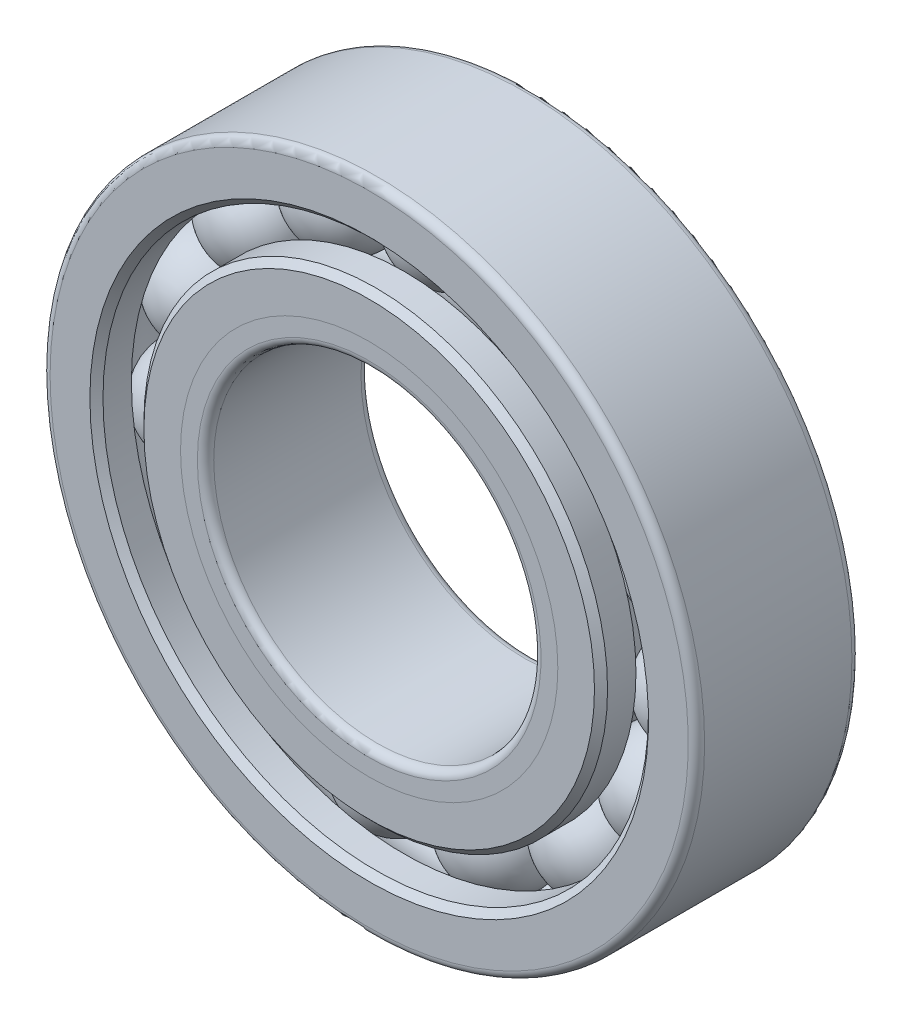
ISO-10303-21;
HEADER;
FILE_DESCRIPTION(('STEP AP214'),'2;1');
FILE_NAME('part.step','',(''),(''),'','','');
FILE_SCHEMA(('AUTOMOTIVE_DESIGN { 1 0 10303 214 1 1 1 1 }'));
ENDSEC;
DATA;
#1=APPLICATION_CONTEXT('core data for automotive mechanical design processes');
#2=APPLICATION_PROTOCOL_DEFINITION('international standard','automotive_design',2000,#1);
#3=PRODUCT_CONTEXT('',#1,'mechanical');
#4=PRODUCT('Part','Part','',(#3));
#5=PRODUCT_RELATED_PRODUCT_CATEGORY('part','',(#4));
#6=PRODUCT_DEFINITION_FORMATION('','',#4);
#7=PRODUCT_DEFINITION_CONTEXT('part definition',#1,'design');
#8=PRODUCT_DEFINITION('design','',#6,#7);
#9=PRODUCT_DEFINITION_SHAPE('','',#8);
#10=(LENGTH_UNIT() NAMED_UNIT(*) SI_UNIT(.MILLI.,.METRE.));
#11=(NAMED_UNIT(*) PLANE_ANGLE_UNIT() SI_UNIT($,.RADIAN.));
#12=(NAMED_UNIT(*) SI_UNIT($,.STERADIAN.) SOLID_ANGLE_UNIT());
#13=UNCERTAINTY_MEASURE_WITH_UNIT(LENGTH_MEASURE(1.E-05),#10,'distance_accuracy_value','');
#14=(GEOMETRIC_REPRESENTATION_CONTEXT(3) GLOBAL_UNCERTAINTY_ASSIGNED_CONTEXT((#13)) GLOBAL_UNIT_ASSIGNED_CONTEXT((#10,
#11,#12)) REPRESENTATION_CONTEXT('',''));
#15=CARTESIAN_POINT('',(0.,0.,0.));
#16=DIRECTION('',(0.,0.,1.));
#17=DIRECTION('',(1.,0.,0.));
#18=AXIS2_PLACEMENT_3D('',#15,#16,#17);
#19=CARTESIAN_POINT('',(0.,0.,-6.36));
#20=DIRECTION('',(0.,0.,1.));
#21=DIRECTION('',(1.,0.,0.));
#22=AXIS2_PLACEMENT_3D('',#19,#20,#21);
#23=CYLINDRICAL_SURFACE('',#22,14.6414066666667);
#24=CARTESIAN_POINT('',(0.,0.,-6.35));
#25=DIRECTION('',(0.,0.,1.));
#26=DIRECTION('',(1.,0.,0.));
#27=AXIS2_PLACEMENT_3D('',#24,#25,#26);
#28=CIRCLE('',#27,14.6414066666667);
#29=CARTESIAN_POINT('',(14.6414066666667,0.,-6.35));
#30=VERTEX_POINT('',#29);
#31=EDGE_CURVE('E57',#30,#30,#28,.T.);
#32=ORIENTED_EDGE('',*,*,#31,.T.);
#33=EDGE_LOOP('',(#32));
#34=FACE_BOUND('',#33,.T.);
#35=CARTESIAN_POINT('',(0.,0.,6.35));
#36=DIRECTION('',(0.,0.,-1.));
#37=DIRECTION('',(-1.,0.,0.));
#38=AXIS2_PLACEMENT_3D('',#35,#36,#37);
#39=CIRCLE('',#38,14.6414066666667);
#40=CARTESIAN_POINT('',(-14.6414066666667,0.,6.35));
#41=VERTEX_POINT('',#40);
#42=EDGE_CURVE('E45',#41,#41,#39,.T.);
#43=ORIENTED_EDGE('',*,*,#42,.T.);
#44=EDGE_LOOP('',(#43));
#45=FACE_BOUND('',#44,.T.);
#46=ADVANCED_FACE('F41',(#34,#45),#23,.T.);
#47=CARTESIAN_POINT('',(0.,12.7,-6.35));
#48=DIRECTION('',(0.,0.,1.));
#49=DIRECTION('',(1.,0.,0.));
#50=AXIS2_PLACEMENT_3D('',#47,#48,#49);
#51=PLANE('',#50);
#52=CARTESIAN_POINT('',(0.,0.,-6.35));
#53=DIRECTION('',(0.,0.,1.));
#54=DIRECTION('',(1.,0.,0.));
#55=AXIS2_PLACEMENT_3D('',#52,#53,#54);
#56=CIRCLE('',#55,13.335);
#57=CARTESIAN_POINT('',(13.335,0.,-6.35));
#58=VERTEX_POINT('',#57);
#59=EDGE_CURVE('E11',#58,#58,#56,.T.);
#60=ORIENTED_EDGE('',*,*,#59,.T.);
#61=EDGE_LOOP('',(#60));
#62=FACE_BOUND('',#61,.T.);
#63=ORIENTED_EDGE('',*,*,#31,.F.);
#64=EDGE_LOOP('',(#63));
#65=FACE_BOUND('',#64,.T.);
#66=ADVANCED_FACE('F43',(#62,#65),#51,.F.);
#67=CARTESIAN_POINT('',(0.,17.99336,6.35));
#68=DIRECTION('',(0.,0.,-1.));
#69=DIRECTION('',(-1.,0.,0.));
#70=AXIS2_PLACEMENT_3D('',#67,#68,#69);
#71=PLANE('',#70);
#72=CARTESIAN_POINT('',(0.,0.,6.35));
#73=DIRECTION('',(0.,0.,-1.));
#74=DIRECTION('',(-1.,0.,0.));
#75=AXIS2_PLACEMENT_3D('',#72,#73,#74);
#76=CIRCLE('',#75,13.335);
#77=CARTESIAN_POINT('',(-13.335,0.,6.35));
#78=VERTEX_POINT('',#77);
#79=EDGE_CURVE('E59',#78,#78,#76,.T.);
#80=ORIENTED_EDGE('',*,*,#79,.T.);
#81=EDGE_LOOP('',(#80));
#82=FACE_BOUND('',#81,.T.);
#83=ORIENTED_EDGE('',*,*,#42,.F.);
#84=EDGE_LOOP('',(#83));
#85=FACE_BOUND('',#84,.T.);
#86=ADVANCED_FACE('F68',(#82,#85),#71,.F.);
#87=CARTESIAN_POINT('',(0.,0.,6.35));
#88=DIRECTION('',(0.,0.,1.));
#89=DIRECTION('',(1.,0.,0.));
#90=AXIS2_PLACEMENT_3D('',#87,#88,#89);
#91=CYLINDRICAL_SURFACE('',#90,12.7);
#92=CARTESIAN_POINT('',(0.,0.,-5.715));
#93=DIRECTION('',(0.,0.,1.));
#94=DIRECTION('',(1.,0.,0.));
#95=AXIS2_PLACEMENT_3D('',#92,#93,#94);
#96=CIRCLE('',#95,12.7);
#97=CARTESIAN_POINT('',(12.7,0.,-5.715));
#98=VERTEX_POINT('',#97);
#99=EDGE_CURVE('E54',#98,#98,#96,.F.);
#100=ORIENTED_EDGE('',*,*,#99,.T.);
#101=EDGE_LOOP('',(#100));
#102=FACE_BOUND('',#101,.T.);
#103=CARTESIAN_POINT('',(0.,0.,5.715));
#104=DIRECTION('',(0.,0.,-1.));
#105=DIRECTION('',(-1.,0.,0.));
#106=AXIS2_PLACEMENT_3D('',#103,#104,#105);
#107=CIRCLE('',#106,12.7);
#108=CARTESIAN_POINT('',(-12.7,0.,5.715));
#109=VERTEX_POINT('',#108);
#110=EDGE_CURVE('E49',#109,#109,#107,.F.);
#111=ORIENTED_EDGE('',*,*,#110,.T.);
#112=EDGE_LOOP('',(#111));
#113=FACE_BOUND('',#112,.T.);
#114=ADVANCED_FACE('F70',(#102,#113),#91,.F.);
#115=CARTESIAN_POINT('',(0.,0.,-5.715));
#116=DIRECTION('',(0.,0.,1.));
#117=DIRECTION('',(1.,0.,0.));
#118=AXIS2_PLACEMENT_3D('',#115,#116,#117);
#119=TOROIDAL_SURFACE('',#118,13.335,0.635);
#120=ORIENTED_EDGE('',*,*,#99,.F.);
#121=EDGE_LOOP('',(#120));
#122=FACE_BOUND('',#121,.T.);
#123=ORIENTED_EDGE('',*,*,#59,.F.);
#124=EDGE_LOOP('',(#123));
#125=FACE_BOUND('',#124,.T.);
#126=ADVANCED_FACE('F76',(#122,#125),#119,.T.);
#127=CARTESIAN_POINT('',(0.,0.,5.715));
#128=DIRECTION('',(0.,0.,-1.));
#129=DIRECTION('',(-1.,0.,0.));
#130=AXIS2_PLACEMENT_3D('',#127,#128,#129);
#131=TOROIDAL_SURFACE('',#130,13.335,0.635);
#132=ORIENTED_EDGE('',*,*,#79,.F.);
#133=EDGE_LOOP('',(#132));
#134=FACE_BOUND('',#133,.T.);
#135=ORIENTED_EDGE('',*,*,#110,.F.);
#136=EDGE_LOOP('',(#135));
#137=FACE_BOUND('',#136,.T.);
#138=ADVANCED_FACE('F81',(#134,#137),#131,.T.);
#139=CLOSED_SHELL('',(#46,#66,#86,#114,#126,#138));
#140=MANIFOLD_SOLID_BREP('B2',#139);
#141=CARTESIAN_POINT('',(0.,0.,-6.36));
#142=DIRECTION('',(0.,0.,1.));
#143=DIRECTION('',(1.,0.,0.));
#144=AXIS2_PLACEMENT_3D('',#141,#142,#143);
#145=CYLINDRICAL_SURFACE('',#144,14.6414066666667);
#146=CARTESIAN_POINT('',(0.,0.,6.35));
#147=DIRECTION('',(0.,0.,-1.));
#148=DIRECTION('',(-1.,0.,0.));
#149=AXIS2_PLACEMENT_3D('',#146,#147,#148);
#150=CIRCLE('',#149,14.6414066666667);
#151=CARTESIAN_POINT('',(-14.6414066666667,0.,6.35));
#152=VERTEX_POINT('',#151);
#153=EDGE_CURVE('E144',#152,#152,#150,.T.);
#154=ORIENTED_EDGE('',*,*,#153,.F.);
#155=EDGE_LOOP('',(#154));
#156=FACE_BOUND('',#155,.T.);
#157=CARTESIAN_POINT('',(0.,0.,-6.35));
#158=DIRECTION('',(0.,0.,1.));
#159=DIRECTION('',(1.,0.,0.));
#160=AXIS2_PLACEMENT_3D('',#157,#158,#159);
#161=CIRCLE('',#160,14.6414066666667);
#162=CARTESIAN_POINT('',(14.6414066666667,0.,-6.35));
#163=VERTEX_POINT('',#162);
#164=EDGE_CURVE('E40',#163,#163,#161,.T.);
#165=ORIENTED_EDGE('',*,*,#164,.F.);
#166=EDGE_LOOP('',(#165));
#167=FACE_BOUND('',#166,.T.);
#168=ADVANCED_FACE('F138',(#156,#167),#145,.F.);
#169=CARTESIAN_POINT('',(0.,0.,0.));
#170=DIRECTION('',(0.,0.,1.));
#171=DIRECTION('',(1.,0.,0.));
#172=AXIS2_PLACEMENT_3D('',#169,#170,#171);
#173=TOROIDAL_SURFACE('',#172,19.58086,3.96875);
#174=CARTESIAN_POINT('',(0.,0.,-3.6374194578712));
#175=DIRECTION('',(0.,0.,1.));
#176=DIRECTION('',(1.,0.,0.));
#177=AXIS2_PLACEMENT_3D('',#174,#175,#176);
#178=CIRCLE('',#177,17.99336);
#179=CARTESIAN_POINT('',(17.99336,0.,-3.6374194578712));
#180=VERTEX_POINT('',#179);
#181=EDGE_CURVE('E166',#180,#180,#178,.T.);
#182=ORIENTED_EDGE('',*,*,#181,.T.);
#183=EDGE_LOOP('',(#182));
#184=FACE_BOUND('',#183,.T.);
#185=CARTESIAN_POINT('',(0.,0.,3.6374194578712));
#186=DIRECTION('',(0.,0.,-1.));
#187=DIRECTION('',(-1.,0.,0.));
#188=AXIS2_PLACEMENT_3D('',#185,#186,#187);
#189=CIRCLE('',#188,17.99336);
#190=CARTESIAN_POINT('',(-17.99336,0.,3.6374194578712));
#191=VERTEX_POINT('',#190);
#192=EDGE_CURVE('E163',#191,#191,#189,.T.);
#193=ORIENTED_EDGE('',*,*,#192,.T.);
#194=EDGE_LOOP('',(#193));
#195=FACE_BOUND('',#194,.T.);
#196=ADVANCED_FACE('F170',(#184,#195),#173,.F.);
#197=CARTESIAN_POINT('',(0.,0.,6.35));
#198=DIRECTION('',(0.,0.,1.));
#199=DIRECTION('',(1.,0.,0.));
#200=AXIS2_PLACEMENT_3D('',#197,#198,#199);
#201=CYLINDRICAL_SURFACE('',#200,17.99336);
#202=CARTESIAN_POINT('',(0.,0.,5.84199999999999));
#203=DIRECTION('',(0.,0.,-1.));
#204=DIRECTION('',(-1.,0.,0.));
#205=AXIS2_PLACEMENT_3D('',#202,#203,#204);
#206=CIRCLE('',#205,17.99336);
#207=CARTESIAN_POINT('',(-17.99336,0.,5.84199999999999));
#208=VERTEX_POINT('',#207);
#209=EDGE_CURVE('E148',#208,#208,#206,.T.);
#210=ORIENTED_EDGE('',*,*,#209,.T.);
#211=EDGE_LOOP('',(#210));
#212=FACE_BOUND('',#211,.T.);
#213=ORIENTED_EDGE('',*,*,#192,.F.);
#214=EDGE_LOOP('',(#213));
#215=FACE_BOUND('',#214,.T.);
#216=ADVANCED_FACE('F179',(#212,#215),#201,.T.);
#217=CARTESIAN_POINT('',(0.,0.,6.35));
#218=DIRECTION('',(0.,0.,-1.));
#219=DIRECTION('',(-1.,0.,0.));
#220=AXIS2_PLACEMENT_3D('',#217,#218,#219);
#221=CONICAL_SURFACE('',#220,17.48536,0.785398163397442);
#222=ORIENTED_EDGE('',*,*,#209,.F.);
#223=EDGE_LOOP('',(#222));
#224=FACE_BOUND('',#223,.T.);
#225=CARTESIAN_POINT('',(0.,0.,6.35));
#226=DIRECTION('',(0.,0.,-1.));
#227=DIRECTION('',(-1.,0.,0.));
#228=AXIS2_PLACEMENT_3D('',#225,#226,#227);
#229=CIRCLE('',#228,17.48536);
#230=CARTESIAN_POINT('',(-17.48536,0.,6.35));
#231=VERTEX_POINT('',#230);
#232=EDGE_CURVE('E152',#231,#231,#229,.F.);
#233=ORIENTED_EDGE('',*,*,#232,.F.);
#234=EDGE_LOOP('',(#233));
#235=FACE_BOUND('',#234,.T.);
#236=ADVANCED_FACE('F187',(#224,#235),#221,.T.);
#237=CARTESIAN_POINT('',(0.,17.99336,6.35));
#238=DIRECTION('',(0.,0.,-1.));
#239=DIRECTION('',(-1.,0.,0.));
#240=AXIS2_PLACEMENT_3D('',#237,#238,#239);
#241=PLANE('',#240);
#242=ORIENTED_EDGE('',*,*,#153,.T.);
#243=EDGE_LOOP('',(#242));
#244=FACE_BOUND('',#243,.T.);
#245=ORIENTED_EDGE('',*,*,#232,.T.);
#246=EDGE_LOOP('',(#245));
#247=FACE_BOUND('',#246,.T.);
#248=ADVANCED_FACE('F176',(#244,#247),#241,.F.);
#249=CARTESIAN_POINT('',(0.,0.,-5.842));
#250=DIRECTION('',(0.,0.,1.));
#251=DIRECTION('',(1.,0.,0.));
#252=AXIS2_PLACEMENT_3D('',#249,#250,#251);
#253=CIRCLE('',#252,17.99336);
#254=CARTESIAN_POINT('',(17.99336,0.,-5.842));
#255=VERTEX_POINT('',#254);
#256=EDGE_CURVE('E160',#255,#255,#253,.T.);
#257=ORIENTED_EDGE('',*,*,#256,.T.);
#258=EDGE_LOOP('',(#257));
#259=FACE_BOUND('',#258,.T.);
#260=ORIENTED_EDGE('',*,*,#181,.F.);
#261=EDGE_LOOP('',(#260));
#262=FACE_BOUND('',#261,.T.);
#263=ADVANCED_FACE('F173',(#259,#262),#201,.T.);
#264=CARTESIAN_POINT('',(0.,0.,-5.842));
#265=DIRECTION('',(0.,0.,1.));
#266=DIRECTION('',(1.,0.,0.));
#267=AXIS2_PLACEMENT_3D('',#264,#265,#266);
#268=CONICAL_SURFACE('',#267,17.99336,0.785398163397448);
#269=CARTESIAN_POINT('',(0.,0.,-6.35));
#270=DIRECTION('',(0.,0.,1.));
#271=DIRECTION('',(1.,0.,0.));
#272=AXIS2_PLACEMENT_3D('',#269,#270,#271);
#273=CIRCLE('',#272,17.48536);
#274=CARTESIAN_POINT('',(17.48536,0.,-6.35));
#275=VERTEX_POINT('',#274);
#276=EDGE_CURVE('E157',#275,#275,#273,.F.);
#277=ORIENTED_EDGE('',*,*,#276,.F.);
#278=EDGE_LOOP('',(#277));
#279=FACE_BOUND('',#278,.T.);
#280=ORIENTED_EDGE('',*,*,#256,.F.);
#281=EDGE_LOOP('',(#280));
#282=FACE_BOUND('',#281,.T.);
#283=ADVANCED_FACE('F175',(#279,#282),#268,.T.);
#284=CARTESIAN_POINT('',(0.,12.7,-6.35));
#285=DIRECTION('',(0.,0.,1.));
#286=DIRECTION('',(1.,0.,0.));
#287=AXIS2_PLACEMENT_3D('',#284,#285,#286);
#288=PLANE('',#287);
#289=ORIENTED_EDGE('',*,*,#164,.T.);
#290=EDGE_LOOP('',(#289));
#291=FACE_BOUND('',#290,.T.);
#292=ORIENTED_EDGE('',*,*,#276,.T.);
#293=EDGE_LOOP('',(#292));
#294=FACE_BOUND('',#293,.T.);
#295=ADVANCED_FACE('F184',(#291,#294),#288,.F.);
#296=CLOSED_SHELL('',(#168,#196,#216,#236,#248,#263,#283,#295));
#297=MANIFOLD_SOLID_BREP('B6',#296);
#298=CARTESIAN_POINT('',(-7.96425326493699,17.8880057097358,0.));
#299=DIRECTION('',(0.,0.,1.));
#300=DIRECTION('',(-0.406736643075789,0.913545457642606,0.));
#301=AXIS2_PLACEMENT_3D('',#298,#299,#300);
#302=SPHERICAL_SURFACE('',#301,3.96875);
#303=CARTESIAN_POINT('',(-7.96425326493699,17.8880057097358,3.96875));
#304=VERTEX_POINT('',#303);
#305=VERTEX_LOOP('',#304);
#306=FACE_BOUND('',#305,.T.);
#307=ADVANCED_FACE('F264',(#306),#302,.T.);
#308=CLOSED_SHELL('',(#307));
#309=MANIFOLD_SOLID_BREP('B35',#308);
#310=CARTESIAN_POINT('',(-14.5514147873971,13.1021527248281,0.));
#311=DIRECTION('',(0.,0.,1.));
#312=DIRECTION('',(-0.743144825477386,0.669130606358867,0.));
#313=AXIS2_PLACEMENT_3D('',#310,#311,#312);
#314=SPHERICAL_SURFACE('',#313,3.96875);
#315=CARTESIAN_POINT('',(-14.5514147873971,13.1021527248281,3.96875));
#316=VERTEX_POINT('',#315);
#317=VERTEX_LOOP('',#316);
#318=FACE_BOUND('',#317,.T.);
#319=ADVANCED_FACE('F284',(#318),#314,.T.);
#320=CLOSED_SHELL('',(#319));
#321=MANIFOLD_SOLID_BREP('B134',#320);
#322=CARTESIAN_POINT('',(-18.6225044976631,6.05081850447683,0.));
#323=DIRECTION('',(0.,0.,1.));
#324=DIRECTION('',(-0.95105651629515,0.309016994374957,0.));
#325=AXIS2_PLACEMENT_3D('',#322,#323,#324);
#326=SPHERICAL_SURFACE('',#325,3.96875);
#327=CARTESIAN_POINT('',(-18.6225044976631,6.05081850447683,3.96875));
#328=VERTEX_POINT('',#327);
#329=VERTEX_LOOP('',#328);
#330=FACE_BOUND('',#329,.T.);
#331=ADVANCED_FACE('F304',(#330),#326,.T.);
#332=CLOSED_SHELL('',(#331));
#333=MANIFOLD_SOLID_BREP('B260',#332);
#334=CARTESIAN_POINT('',(-19.4735940001408,-2.04675720525887,0.));
#335=DIRECTION('',(0.,0.,1.));
#336=DIRECTION('',(-0.994521895368274,-0.104528463267644,0.));
#337=AXIS2_PLACEMENT_3D('',#334,#335,#336);
#338=SPHERICAL_SURFACE('',#337,3.96875);
#339=CARTESIAN_POINT('',(-19.4735940001408,-2.04675720525887,3.96875));
#340=VERTEX_POINT('',#339);
#341=VERTEX_LOOP('',#340);
#342=FACE_BOUND('',#341,.T.);
#343=ADVANCED_FACE('F324',(#342),#338,.T.);
#344=CLOSED_SHELL('',(#343));
#345=MANIFOLD_SOLID_BREP('B280',#344);
#346=CARTESIAN_POINT('',(-16.9575221879467,-9.79042999999984,0.));
#347=DIRECTION('',(0.,0.,1.));
#348=DIRECTION('',(-0.866025403784443,-0.499999999999992,0.));
#349=AXIS2_PLACEMENT_3D('',#346,#347,#348);
#350=SPHERICAL_SURFACE('',#349,3.96875);
#351=CARTESIAN_POINT('',(-16.9575221879467,-9.79042999999984,3.96875));
#352=VERTEX_POINT('',#351);
#353=VERTEX_LOOP('',#352);
#354=FACE_BOUND('',#353,.T.);
#355=ADVANCED_FACE('F344',(#354),#350,.T.);
#356=CLOSED_SHELL('',(#355));
#357=MANIFOLD_SOLID_BREP('B300',#356);
#358=CARTESIAN_POINT('',(-11.5093407352037,-15.8412485044765,0.));
#359=DIRECTION('',(0.,0.,1.));
#360=DIRECTION('',(-0.58778525229248,-0.809016994374943,0.));
#361=AXIS2_PLACEMENT_3D('',#358,#359,#360);
#362=SPHERICAL_SURFACE('',#361,3.96875);
#363=CARTESIAN_POINT('',(-11.5093407352037,-15.8412485044765,3.96875));
#364=VERTEX_POINT('',#363);
#365=VERTEX_LOOP('',#364);
#366=FACE_BOUND('',#365,.T.);
#367=ADVANCED_FACE('F364',(#366),#362,.T.);
#368=CLOSED_SHELL('',(#367));
#369=MANIFOLD_SOLID_BREP('B320',#368);
#370=CARTESIAN_POINT('',(-4.07108971026597,-19.1529712293045,0.));
#371=DIRECTION('',(0.,0.,1.));
#372=DIRECTION('',(-0.207911690817766,-0.978147600733804,0.));
#373=AXIS2_PLACEMENT_3D('',#370,#371,#372);
#374=SPHERICAL_SURFACE('',#373,3.96875);
#375=CARTESIAN_POINT('',(-4.07108971026597,-19.1529712293045,3.96875));
#376=VERTEX_POINT('',#375);
#377=VERTEX_LOOP('',#376);
#378=FACE_BOUND('',#377,.T.);
#379=ADVANCED_FACE('F384',(#378),#374,.T.);
#380=CLOSED_SHELL('',(#379));
#381=MANIFOLD_SOLID_BREP('B340',#380);
#382=CARTESIAN_POINT('',(4.07108971026571,-19.1529712293046,0.));
#383=DIRECTION('',(0.,0.,1.));
#384=DIRECTION('',(0.207911690817753,-0.978147600733807,0.));
#385=AXIS2_PLACEMENT_3D('',#382,#383,#384);
#386=SPHERICAL_SURFACE('',#385,3.96875);
#387=CARTESIAN_POINT('',(4.07108971026571,-19.1529712293046,3.96875));
#388=VERTEX_POINT('',#387);
#389=VERTEX_LOOP('',#388);
#390=FACE_BOUND('',#389,.T.);
#391=ADVANCED_FACE('F404',(#390),#386,.T.);
#392=CLOSED_SHELL('',(#391));
#393=MANIFOLD_SOLID_BREP('B360',#392);
#394=CARTESIAN_POINT('',(11.5093407352035,-15.8412485044767,0.));
#395=DIRECTION('',(0.,0.,1.));
#396=DIRECTION('',(0.587785252292469,-0.80901699437495,0.));
#397=AXIS2_PLACEMENT_3D('',#394,#395,#396);
#398=SPHERICAL_SURFACE('',#397,3.96875);
#399=CARTESIAN_POINT('',(11.5093407352035,-15.8412485044767,3.96875));
#400=VERTEX_POINT('',#399);
#401=VERTEX_LOOP('',#400);
#402=FACE_BOUND('',#401,.T.);
#403=ADVANCED_FACE('F424',(#402),#398,.T.);
#404=CLOSED_SHELL('',(#403));
#405=MANIFOLD_SOLID_BREP('B380',#404);
#406=CARTESIAN_POINT('',(16.9575221879465,-9.79043000000008,0.));
#407=DIRECTION('',(0.,0.,1.));
#408=DIRECTION('',(0.866025403784436,-0.500000000000004,0.));
#409=AXIS2_PLACEMENT_3D('',#406,#407,#408);
#410=SPHERICAL_SURFACE('',#409,3.96875);
#411=CARTESIAN_POINT('',(16.9575221879465,-9.79043000000008,3.96875));
#412=VERTEX_POINT('',#411);
#413=VERTEX_LOOP('',#412);
#414=FACE_BOUND('',#413,.T.);
#415=ADVANCED_FACE('F444',(#414),#410,.T.);
#416=CLOSED_SHELL('',(#415));
#417=MANIFOLD_SOLID_BREP('B400',#416);
#418=CARTESIAN_POINT('',(19.4735940001408,-2.04675720525914,0.));
#419=DIRECTION('',(0.,0.,1.));
#420=DIRECTION('',(0.994521895368273,-0.104528463267657,0.));
#421=AXIS2_PLACEMENT_3D('',#418,#419,#420);
#422=SPHERICAL_SURFACE('',#421,3.96875);
#423=CARTESIAN_POINT('',(19.4735940001408,-2.04675720525914,3.96875));
#424=VERTEX_POINT('',#423);
#425=VERTEX_LOOP('',#424);
#426=FACE_BOUND('',#425,.T.);
#427=ADVANCED_FACE('F464',(#426),#422,.T.);
#428=CLOSED_SHELL('',(#427));
#429=MANIFOLD_SOLID_BREP('B420',#428);
#430=CARTESIAN_POINT('',(18.6225044976631,6.05081850447658,0.));
#431=DIRECTION('',(0.,0.,1.));
#432=DIRECTION('',(0.951056516295154,0.309016994374945,0.));
#433=AXIS2_PLACEMENT_3D('',#430,#431,#432);
#434=SPHERICAL_SURFACE('',#433,3.96875);
#435=CARTESIAN_POINT('',(18.6225044976631,6.05081850447658,3.96875));
#436=VERTEX_POINT('',#435);
#437=VERTEX_LOOP('',#436);
#438=FACE_BOUND('',#437,.T.);
#439=ADVANCED_FACE('F484',(#438),#434,.T.);
#440=CLOSED_SHELL('',(#439));
#441=MANIFOLD_SOLID_BREP('B440',#440);
#442=CARTESIAN_POINT('',(14.5514147873973,13.1021527248279,0.));
#443=DIRECTION('',(0.,0.,1.));
#444=DIRECTION('',(0.743144825477395,0.669130606358857,0.));
#445=AXIS2_PLACEMENT_3D('',#442,#443,#444);
#446=SPHERICAL_SURFACE('',#445,3.96875);
#447=CARTESIAN_POINT('',(14.5514147873973,13.1021527248279,3.96875));
#448=VERTEX_POINT('',#447);
#449=VERTEX_LOOP('',#448);
#450=FACE_BOUND('',#449,.T.);
#451=ADVANCED_FACE('F504',(#450),#446,.T.);
#452=CLOSED_SHELL('',(#451));
#453=MANIFOLD_SOLID_BREP('B460',#452);
#454=CARTESIAN_POINT('',(7.96425326493723,17.8880057097357,0.));
#455=DIRECTION('',(0.,0.,1.));
#456=DIRECTION('',(0.406736643075801,0.913545457642601,0.));
#457=AXIS2_PLACEMENT_3D('',#454,#455,#456);
#458=SPHERICAL_SURFACE('',#457,3.96875);
#459=CARTESIAN_POINT('',(7.96425326493723,17.8880057097357,3.96875));
#460=VERTEX_POINT('',#459);
#461=VERTEX_LOOP('',#460);
#462=FACE_BOUND('',#461,.T.);
#463=ADVANCED_FACE('F524',(#462),#458,.T.);
#464=CLOSED_SHELL('',(#463));
#465=MANIFOLD_SOLID_BREP('B480',#464);
#466=CARTESIAN_POINT('',(0.,19.58086,0.));
#467=DIRECTION('',(0.,0.,1.));
#468=DIRECTION('',(0.,1.,0.));
#469=AXIS2_PLACEMENT_3D('',#466,#467,#468);
#470=SPHERICAL_SURFACE('',#469,3.96875);
#471=CARTESIAN_POINT('',(0.,19.58086,3.96875));
#472=VERTEX_POINT('',#471);
#473=VERTEX_LOOP('',#472);
#474=FACE_BOUND('',#473,.T.);
#475=ADVANCED_FACE('F545',(#474),#470,.T.);
#476=CLOSED_SHELL('',(#475));
#477=MANIFOLD_SOLID_BREP('B500',#476);
#478=CARTESIAN_POINT('',(0.,0.,6.35));
#479=DIRECTION('',(0.,0.,1.));
#480=DIRECTION('',(1.,0.,0.));
#481=AXIS2_PLACEMENT_3D('',#478,#479,#480);
#482=CYLINDRICAL_SURFACE('',#481,21.16836);
#483=CARTESIAN_POINT('',(0.,0.,5.84199999999998));
#484=DIRECTION('',(0.,0.,-1.));
#485=DIRECTION('',(-1.,0.,0.));
#486=AXIS2_PLACEMENT_3D('',#483,#484,#485);
#487=CIRCLE('',#486,21.16836);
#488=CARTESIAN_POINT('',(-21.16836,0.,5.84199999999998));
#489=VERTEX_POINT('',#488);
#490=EDGE_CURVE('E564',#489,#489,#487,.F.);
#491=ORIENTED_EDGE('',*,*,#490,.T.);
#492=EDGE_LOOP('',(#491));
#493=FACE_BOUND('',#492,.T.);
#494=CARTESIAN_POINT('',(0.,0.,3.6374194578712));
#495=DIRECTION('',(0.,0.,-1.));
#496=DIRECTION('',(-1.,0.,0.));
#497=AXIS2_PLACEMENT_3D('',#494,#495,#496);
#498=CIRCLE('',#497,21.16836);
#499=CARTESIAN_POINT('',(-21.16836,0.,3.6374194578712));
#500=VERTEX_POINT('',#499);
#501=EDGE_CURVE('E589',#500,#500,#498,.F.);
#502=ORIENTED_EDGE('',*,*,#501,.F.);
#503=EDGE_LOOP('',(#502));
#504=FACE_BOUND('',#503,.T.);
#505=ADVANCED_FACE('F557',(#493,#504),#482,.F.);
#506=CARTESIAN_POINT('',(0.,0.,-5.842));
#507=DIRECTION('',(0.,0.,1.));
#508=DIRECTION('',(1.,0.,0.));
#509=AXIS2_PLACEMENT_3D('',#506,#507,#508);
#510=CIRCLE('',#509,21.16836);
#511=CARTESIAN_POINT('',(21.16836,0.,-5.842));
#512=VERTEX_POINT('',#511);
#513=EDGE_CURVE('E568',#512,#512,#510,.F.);
#514=ORIENTED_EDGE('',*,*,#513,.T.);
#515=EDGE_LOOP('',(#514));
#516=FACE_BOUND('',#515,.T.);
#517=CARTESIAN_POINT('',(0.,0.,-3.6374194578712));
#518=DIRECTION('',(0.,0.,1.));
#519=DIRECTION('',(1.,0.,0.));
#520=AXIS2_PLACEMENT_3D('',#517,#518,#519);
#521=CIRCLE('',#520,21.16836);
#522=CARTESIAN_POINT('',(21.16836,0.,-3.6374194578712));
#523=VERTEX_POINT('',#522);
#524=EDGE_CURVE('E592',#523,#523,#521,.F.);
#525=ORIENTED_EDGE('',*,*,#524,.F.);
#526=EDGE_LOOP('',(#525));
#527=FACE_BOUND('',#526,.T.);
#528=ADVANCED_FACE('F599',(#516,#527),#482,.F.);
#529=CARTESIAN_POINT('',(0.,0.,6.35));
#530=DIRECTION('',(0.,0.,1.));
#531=DIRECTION('',(1.,0.,0.));
#532=AXIS2_PLACEMENT_3D('',#529,#530,#531);
#533=CYLINDRICAL_SURFACE('',#532,25.4);
#534=CARTESIAN_POINT('',(0.,0.,-5.715));
#535=DIRECTION('',(0.,0.,1.));
#536=DIRECTION('',(1.,0.,0.));
#537=AXIS2_PLACEMENT_3D('',#534,#535,#536);
#538=CIRCLE('',#537,25.4);
#539=CARTESIAN_POINT('',(25.4,0.,-5.715));
#540=VERTEX_POINT('',#539);
#541=EDGE_CURVE('E583',#540,#540,#538,.T.);
#542=ORIENTED_EDGE('',*,*,#541,.T.);
#543=EDGE_LOOP('',(#542));
#544=FACE_BOUND('',#543,.T.);
#545=CARTESIAN_POINT('',(0.,0.,5.715));
#546=DIRECTION('',(0.,0.,-1.));
#547=DIRECTION('',(-1.,0.,0.));
#548=AXIS2_PLACEMENT_3D('',#545,#546,#547);
#549=CIRCLE('',#548,25.4);
#550=CARTESIAN_POINT('',(-25.4,0.,5.715));
#551=VERTEX_POINT('',#550);
#552=EDGE_CURVE('E586',#551,#551,#549,.T.);
#553=ORIENTED_EDGE('',*,*,#552,.T.);
#554=EDGE_LOOP('',(#553));
#555=FACE_BOUND('',#554,.T.);
#556=ADVANCED_FACE('F601',(#544,#555),#533,.T.);
#557=CARTESIAN_POINT('',(0.,25.4,6.35));
#558=DIRECTION('',(0.,0.,-1.));
#559=DIRECTION('',(-1.,0.,0.));
#560=AXIS2_PLACEMENT_3D('',#557,#558,#559);
#561=PLANE('',#560);
#562=CARTESIAN_POINT('',(0.,0.,6.35));
#563=DIRECTION('',(0.,0.,-1.));
#564=DIRECTION('',(-1.,0.,0.));
#565=AXIS2_PLACEMENT_3D('',#562,#563,#564);
#566=CIRCLE('',#565,21.67636);
#567=CARTESIAN_POINT('',(-21.67636,0.,6.35));
#568=VERTEX_POINT('',#567);
#569=EDGE_CURVE('E544',#568,#568,#566,.T.);
#570=ORIENTED_EDGE('',*,*,#569,.T.);
#571=EDGE_LOOP('',(#570));
#572=FACE_BOUND('',#571,.T.);
#573=CARTESIAN_POINT('',(0.,0.,6.35));
#574=DIRECTION('',(0.,0.,-1.));
#575=DIRECTION('',(-1.,0.,0.));
#576=AXIS2_PLACEMENT_3D('',#573,#574,#575);
#577=CIRCLE('',#576,24.765);
#578=CARTESIAN_POINT('',(-24.765,0.,6.35));
#579=VERTEX_POINT('',#578);
#580=EDGE_CURVE('E577',#579,#579,#577,.F.);
#581=ORIENTED_EDGE('',*,*,#580,.T.);
#582=EDGE_LOOP('',(#581));
#583=FACE_BOUND('',#582,.T.);
#584=ADVANCED_FACE('F608',(#572,#583),#561,.F.);
#585=CARTESIAN_POINT('',(0.,21.16836,-6.35));
#586=DIRECTION('',(0.,0.,1.));
#587=DIRECTION('',(1.,0.,0.));
#588=AXIS2_PLACEMENT_3D('',#585,#586,#587);
#589=PLANE('',#588);
#590=CARTESIAN_POINT('',(0.,0.,-6.35));
#591=DIRECTION('',(0.,0.,1.));
#592=DIRECTION('',(1.,0.,0.));
#593=AXIS2_PLACEMENT_3D('',#590,#591,#592);
#594=CIRCLE('',#593,21.67636);
#595=CARTESIAN_POINT('',(21.67636,0.,-6.35));
#596=VERTEX_POINT('',#595);
#597=EDGE_CURVE('E572',#596,#596,#594,.T.);
#598=ORIENTED_EDGE('',*,*,#597,.T.);
#599=EDGE_LOOP('',(#598));
#600=FACE_BOUND('',#599,.T.);
#601=CARTESIAN_POINT('',(0.,0.,-6.35));
#602=DIRECTION('',(0.,0.,1.));
#603=DIRECTION('',(1.,0.,0.));
#604=AXIS2_PLACEMENT_3D('',#601,#602,#603);
#605=CIRCLE('',#604,24.765);
#606=CARTESIAN_POINT('',(24.765,0.,-6.35));
#607=VERTEX_POINT('',#606);
#608=EDGE_CURVE('E580',#607,#607,#605,.F.);
#609=ORIENTED_EDGE('',*,*,#608,.T.);
#610=EDGE_LOOP('',(#609));
#611=FACE_BOUND('',#610,.T.);
#612=ADVANCED_FACE('F613',(#600,#611),#589,.F.);
#613=CARTESIAN_POINT('',(0.,0.,0.));
#614=DIRECTION('',(0.,0.,1.));
#615=DIRECTION('',(1.,0.,0.));
#616=AXIS2_PLACEMENT_3D('',#613,#614,#615);
#617=TOROIDAL_SURFACE('',#616,19.58086,3.96875);
#618=ORIENTED_EDGE('',*,*,#524,.T.);
#619=EDGE_LOOP('',(#618));
#620=FACE_BOUND('',#619,.T.);
#621=ORIENTED_EDGE('',*,*,#501,.T.);
#622=EDGE_LOOP('',(#621));
#623=FACE_BOUND('',#622,.T.);
#624=ADVANCED_FACE('F596',(#620,#623),#617,.F.);
#625=CARTESIAN_POINT('',(0.,0.,-5.715));
#626=DIRECTION('',(0.,0.,1.));
#627=DIRECTION('',(1.,0.,0.));
#628=AXIS2_PLACEMENT_3D('',#625,#626,#627);
#629=TOROIDAL_SURFACE('',#628,24.765,0.635);
#630=ORIENTED_EDGE('',*,*,#608,.F.);
#631=EDGE_LOOP('',(#630));
#632=FACE_BOUND('',#631,.T.);
#633=ORIENTED_EDGE('',*,*,#541,.F.);
#634=EDGE_LOOP('',(#633));
#635=FACE_BOUND('',#634,.T.);
#636=ADVANCED_FACE('F617',(#632,#635),#629,.T.);
#637=CARTESIAN_POINT('',(0.,0.,5.715));
#638=DIRECTION('',(0.,0.,-1.));
#639=DIRECTION('',(-1.,0.,0.));
#640=AXIS2_PLACEMENT_3D('',#637,#638,#639);
#641=TOROIDAL_SURFACE('',#640,24.765,0.635);
#642=ORIENTED_EDGE('',*,*,#552,.F.);
#643=EDGE_LOOP('',(#642));
#644=FACE_BOUND('',#643,.T.);
#645=ORIENTED_EDGE('',*,*,#580,.F.);
#646=EDGE_LOOP('',(#645));
#647=FACE_BOUND('',#646,.T.);
#648=ADVANCED_FACE('F620',(#644,#647),#641,.T.);
#649=CARTESIAN_POINT('',(0.,0.,-6.35));
#650=DIRECTION('',(0.,0.,-1.));
#651=DIRECTION('',(-1.,0.,0.));
#652=AXIS2_PLACEMENT_3D('',#649,#650,#651);
#653=CONICAL_SURFACE('',#652,21.67636,0.785398163397448);
#654=ORIENTED_EDGE('',*,*,#513,.F.);
#655=EDGE_LOOP('',(#654));
#656=FACE_BOUND('',#655,.T.);
#657=ORIENTED_EDGE('',*,*,#597,.F.);
#658=EDGE_LOOP('',(#657));
#659=FACE_BOUND('',#658,.T.);
#660=ADVANCED_FACE('F623',(#656,#659),#653,.F.);
#661=CARTESIAN_POINT('',(0.,0.,5.84199999999998));
#662=DIRECTION('',(0.,0.,1.));
#663=DIRECTION('',(1.,0.,0.));
#664=AXIS2_PLACEMENT_3D('',#661,#662,#663);
#665=CONICAL_SURFACE('',#664,21.16836,0.785398163397445);
#666=ORIENTED_EDGE('',*,*,#569,.F.);
#667=EDGE_LOOP('',(#666));
#668=FACE_BOUND('',#667,.T.);
#669=ORIENTED_EDGE('',*,*,#490,.F.);
#670=EDGE_LOOP('',(#669));
#671=FACE_BOUND('',#670,.T.);
#672=ADVANCED_FACE('F559',(#668,#671),#665,.F.);
#673=CLOSED_SHELL('',(#505,#528,#556,#584,#612,#624,#636,#648,#660,#672));
#674=MANIFOLD_SOLID_BREP('B520',#673);
#675=ADVANCED_BREP_SHAPE_REPRESENTATION('',(#18,#140,#297,#309,#321,#333,#345,#357,#369,#381,
#393,#405,#417,#429,#441,#453,#465,#477,#674),#14);
#676=SHAPE_DEFINITION_REPRESENTATION(#9,#675);
ENDSEC;
END-ISO-10303-21;
